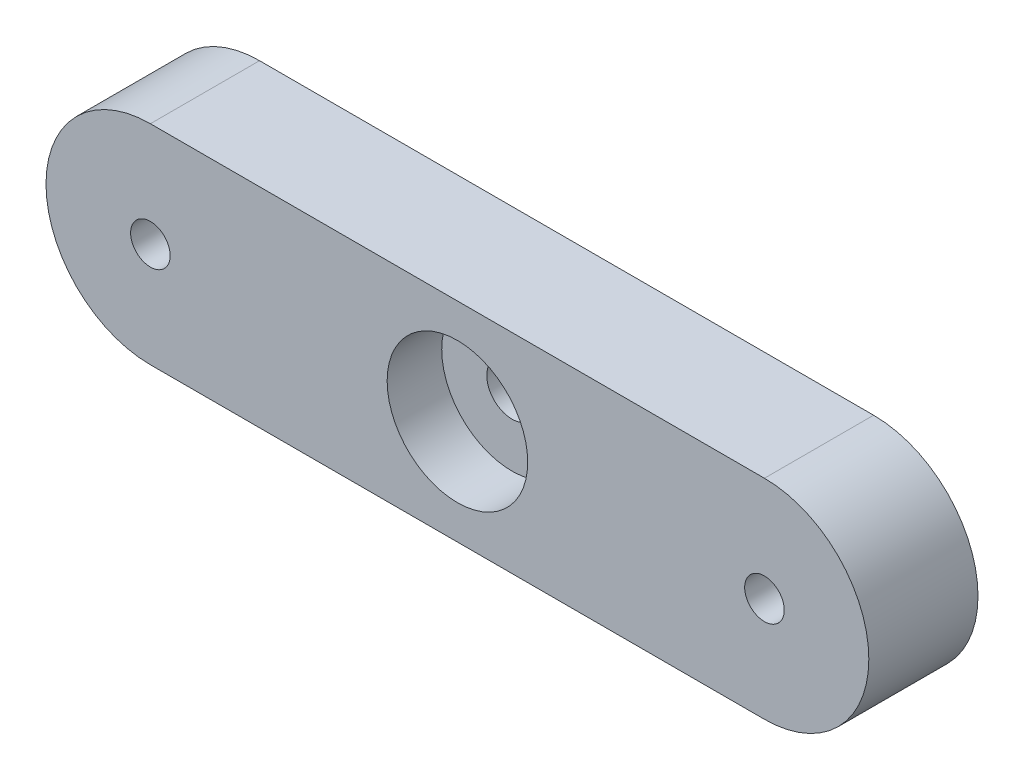
ISO-10303-21;
HEADER;
FILE_DESCRIPTION(('STEP AP214'),'2;1');
FILE_NAME('part.step','',(''),(''),'','','');
FILE_SCHEMA(('AUTOMOTIVE_DESIGN { 1 0 10303 214 1 1 1 1 }'));
ENDSEC;
DATA;
#1=APPLICATION_CONTEXT('core data for automotive mechanical design processes');
#2=APPLICATION_PROTOCOL_DEFINITION('international standard','automotive_design',2000,#1);
#3=PRODUCT_CONTEXT('',#1,'mechanical');
#4=PRODUCT('Part','Part','',(#3));
#5=PRODUCT_RELATED_PRODUCT_CATEGORY('part','',(#4));
#6=PRODUCT_DEFINITION_FORMATION('','',#4);
#7=PRODUCT_DEFINITION_CONTEXT('part definition',#1,'design');
#8=PRODUCT_DEFINITION('design','',#6,#7);
#9=PRODUCT_DEFINITION_SHAPE('','',#8);
#10=(LENGTH_UNIT() NAMED_UNIT(*) SI_UNIT(.MILLI.,.METRE.));
#11=(NAMED_UNIT(*) PLANE_ANGLE_UNIT() SI_UNIT($,.RADIAN.));
#12=(NAMED_UNIT(*) SI_UNIT($,.STERADIAN.) SOLID_ANGLE_UNIT());
#13=UNCERTAINTY_MEASURE_WITH_UNIT(LENGTH_MEASURE(1.E-05),#10,'distance_accuracy_value','');
#14=(GEOMETRIC_REPRESENTATION_CONTEXT(3) GLOBAL_UNCERTAINTY_ASSIGNED_CONTEXT((#13)) GLOBAL_UNIT_ASSIGNED_CONTEXT((#10,
#11,#12)) REPRESENTATION_CONTEXT('',''));
#15=CARTESIAN_POINT('',(0.,0.,0.));
#16=DIRECTION('',(0.,0.,1.));
#17=DIRECTION('',(1.,0.,0.));
#18=AXIS2_PLACEMENT_3D('',#15,#16,#17);
#19=CARTESIAN_POINT('',(22.5,0.,8.));
#20=DIRECTION('',(0.,0.,-1.));
#21=DIRECTION('',(-1.,0.,0.));
#22=AXIS2_PLACEMENT_3D('',#19,#20,#21);
#23=CYLINDRICAL_SURFACE('',#22,5.15);
#24=CARTESIAN_POINT('',(22.5,0.,8.));
#25=DIRECTION('',(0.,0.,1.));
#26=DIRECTION('',(1.,0.,0.));
#27=AXIS2_PLACEMENT_3D('',#24,#25,#26);
#28=CIRCLE('',#27,5.15);
#29=CARTESIAN_POINT('',(27.65,0.,8.));
#30=VERTEX_POINT('',#29);
#31=EDGE_CURVE('E124',#30,#30,#28,.T.);
#32=ORIENTED_EDGE('',*,*,#31,.T.);
#33=EDGE_LOOP('',(#32));
#34=FACE_BOUND('',#33,.T.);
#35=CARTESIAN_POINT('',(22.5,0.,4.));
#36=DIRECTION('',(0.,0.,-1.));
#37=DIRECTION('',(-1.,0.,0.));
#38=AXIS2_PLACEMENT_3D('',#35,#36,#37);
#39=CIRCLE('',#38,5.15);
#40=CARTESIAN_POINT('',(17.35,0.,4.));
#41=VERTEX_POINT('',#40);
#42=EDGE_CURVE('E37',#41,#41,#39,.T.);
#43=ORIENTED_EDGE('',*,*,#42,.T.);
#44=EDGE_LOOP('',(#43));
#45=FACE_BOUND('',#44,.T.);
#46=ADVANCED_FACE('F33',(#34,#45),#23,.F.);
#47=CARTESIAN_POINT('',(0.,0.,8.));
#48=DIRECTION('',(0.,0.,1.));
#49=DIRECTION('',(1.,0.,0.));
#50=AXIS2_PLACEMENT_3D('',#47,#48,#49);
#51=PLANE('',#50);
#52=CARTESIAN_POINT('',(45.,0.,8.));
#53=DIRECTION('',(0.,0.,1.));
#54=DIRECTION('',(1.,0.,0.));
#55=AXIS2_PLACEMENT_3D('',#52,#53,#54);
#56=CIRCLE('',#55,1.45);
#57=CARTESIAN_POINT('',(46.45,0.,8.));
#58=VERTEX_POINT('',#57);
#59=EDGE_CURVE('E118',#58,#58,#56,.T.);
#60=ORIENTED_EDGE('',*,*,#59,.F.);
#61=EDGE_LOOP('',(#60));
#62=FACE_BOUND('',#61,.T.);
#63=CARTESIAN_POINT('',(0.,0.,8.));
#64=DIRECTION('',(0.,0.,1.));
#65=DIRECTION('',(1.,0.,0.));
#66=AXIS2_PLACEMENT_3D('',#63,#64,#65);
#67=CIRCLE('',#66,7.65);
#68=CARTESIAN_POINT('',(0.,7.65,8.));
#69=VERTEX_POINT('',#68);
#70=CARTESIAN_POINT('',(0.,-7.65,8.));
#71=VERTEX_POINT('',#70);
#72=EDGE_CURVE('E87',#69,#71,#67,.T.);
#73=ORIENTED_EDGE('',*,*,#72,.T.);
#74=DIRECTION('',(1.,0.,0.));
#75=VECTOR('',#74,1.);
#76=CARTESIAN_POINT('',(0.,-7.65,8.));
#77=LINE('',#76,#75);
#78=CARTESIAN_POINT('',(45.,-7.65,8.));
#79=VERTEX_POINT('',#78);
#80=EDGE_CURVE('E81',#71,#79,#77,.T.);
#81=ORIENTED_EDGE('',*,*,#80,.T.);
#82=CARTESIAN_POINT('',(45.,0.,8.));
#83=DIRECTION('',(0.,0.,1.));
#84=DIRECTION('',(1.,0.,0.));
#85=AXIS2_PLACEMENT_3D('',#82,#83,#84);
#86=CIRCLE('',#85,7.65);
#87=CARTESIAN_POINT('',(45.,7.65,8.));
#88=VERTEX_POINT('',#87);
#89=EDGE_CURVE('E85',#79,#88,#86,.T.);
#90=ORIENTED_EDGE('',*,*,#89,.T.);
#91=DIRECTION('',(-1.,0.,0.));
#92=VECTOR('',#91,1.);
#93=CARTESIAN_POINT('',(0.,7.65,8.));
#94=LINE('',#93,#92);
#95=EDGE_CURVE('E51',#88,#69,#94,.T.);
#96=ORIENTED_EDGE('',*,*,#95,.T.);
#97=EDGE_LOOP('',(#73,#81,#90,#96));
#98=FACE_BOUND('',#97,.T.);
#99=CARTESIAN_POINT('',(0.,0.,8.));
#100=DIRECTION('',(0.,0.,1.));
#101=DIRECTION('',(1.,0.,0.));
#102=AXIS2_PLACEMENT_3D('',#99,#100,#101);
#103=CIRCLE('',#102,1.45);
#104=CARTESIAN_POINT('',(1.45,0.,8.));
#105=VERTEX_POINT('',#104);
#106=EDGE_CURVE('E103',#105,#105,#103,.T.);
#107=ORIENTED_EDGE('',*,*,#106,.F.);
#108=EDGE_LOOP('',(#107));
#109=FACE_BOUND('',#108,.T.);
#110=ORIENTED_EDGE('',*,*,#31,.F.);
#111=EDGE_LOOP('',(#110));
#112=FACE_BOUND('',#111,.T.);
#113=ADVANCED_FACE('F82',(#62,#98,#109,#112),#51,.T.);
#114=CARTESIAN_POINT('',(0.,0.,0.));
#115=DIRECTION('',(0.,0.,1.));
#116=DIRECTION('',(1.,0.,0.));
#117=AXIS2_PLACEMENT_3D('',#114,#115,#116);
#118=PLANE('',#117);
#119=CARTESIAN_POINT('',(0.,0.,0.));
#120=DIRECTION('',(0.,0.,1.));
#121=DIRECTION('',(1.,0.,0.));
#122=AXIS2_PLACEMENT_3D('',#119,#120,#121);
#123=CIRCLE('',#122,7.65);
#124=CARTESIAN_POINT('',(0.,7.65,0.));
#125=VERTEX_POINT('',#124);
#126=CARTESIAN_POINT('',(0.,-7.65,0.));
#127=VERTEX_POINT('',#126);
#128=EDGE_CURVE('E100',#125,#127,#123,.T.);
#129=ORIENTED_EDGE('',*,*,#128,.F.);
#130=DIRECTION('',(-1.,0.,0.));
#131=VECTOR('',#130,1.);
#132=CARTESIAN_POINT('',(0.,7.65,0.));
#133=LINE('',#132,#131);
#134=CARTESIAN_POINT('',(45.,7.65,0.));
#135=VERTEX_POINT('',#134);
#136=EDGE_CURVE('E74',#135,#125,#133,.T.);
#137=ORIENTED_EDGE('',*,*,#136,.F.);
#138=CARTESIAN_POINT('',(45.,0.,0.));
#139=DIRECTION('',(0.,0.,1.));
#140=DIRECTION('',(1.,0.,0.));
#141=AXIS2_PLACEMENT_3D('',#138,#139,#140);
#142=CIRCLE('',#141,7.65);
#143=CARTESIAN_POINT('',(45.,-7.65,0.));
#144=VERTEX_POINT('',#143);
#145=EDGE_CURVE('E68',#144,#135,#142,.T.);
#146=ORIENTED_EDGE('',*,*,#145,.F.);
#147=DIRECTION('',(1.,0.,0.));
#148=VECTOR('',#147,1.);
#149=CARTESIAN_POINT('',(0.,-7.65,0.));
#150=LINE('',#149,#148);
#151=EDGE_CURVE('E91',#127,#144,#150,.T.);
#152=ORIENTED_EDGE('',*,*,#151,.F.);
#153=EDGE_LOOP('',(#129,#137,#146,#152));
#154=FACE_BOUND('',#153,.T.);
#155=CARTESIAN_POINT('',(0.,0.,0.));
#156=DIRECTION('',(0.,0.,1.));
#157=DIRECTION('',(1.,0.,0.));
#158=AXIS2_PLACEMENT_3D('',#155,#156,#157);
#159=CIRCLE('',#158,1.45);
#160=CARTESIAN_POINT('',(1.45,0.,0.));
#161=VERTEX_POINT('',#160);
#162=EDGE_CURVE('E115',#161,#161,#159,.T.);
#163=ORIENTED_EDGE('',*,*,#162,.T.);
#164=EDGE_LOOP('',(#163));
#165=FACE_BOUND('',#164,.T.);
#166=CARTESIAN_POINT('',(45.,0.,0.));
#167=DIRECTION('',(0.,0.,1.));
#168=DIRECTION('',(1.,0.,0.));
#169=AXIS2_PLACEMENT_3D('',#166,#167,#168);
#170=CIRCLE('',#169,1.45);
#171=CARTESIAN_POINT('',(46.45,0.,0.));
#172=VERTEX_POINT('',#171);
#173=EDGE_CURVE('E121',#172,#172,#170,.T.);
#174=ORIENTED_EDGE('',*,*,#173,.T.);
#175=EDGE_LOOP('',(#174));
#176=FACE_BOUND('',#175,.T.);
#177=CARTESIAN_POINT('',(22.5,0.,0.));
#178=DIRECTION('',(0.,0.,-1.));
#179=DIRECTION('',(-1.,0.,0.));
#180=AXIS2_PLACEMENT_3D('',#177,#178,#179);
#181=CIRCLE('',#180,1.85);
#182=CARTESIAN_POINT('',(20.65,0.,0.));
#183=VERTEX_POINT('',#182);
#184=EDGE_CURVE('E129',#183,#183,#181,.T.);
#185=ORIENTED_EDGE('',*,*,#184,.F.);
#186=EDGE_LOOP('',(#185));
#187=FACE_BOUND('',#186,.T.);
#188=ADVANCED_FACE('F111',(#154,#165,#176,#187),#118,.F.);
#189=CARTESIAN_POINT('',(0.,0.,8.));
#190=DIRECTION('',(0.,0.,-1.));
#191=DIRECTION('',(-1.,0.,0.));
#192=AXIS2_PLACEMENT_3D('',#189,#190,#191);
#193=CYLINDRICAL_SURFACE('',#192,7.65);
#194=ORIENTED_EDGE('',*,*,#128,.T.);
#195=DIRECTION('',(0.,0.,-1.));
#196=VECTOR('',#195,1.);
#197=CARTESIAN_POINT('',(0.,-7.65,8.));
#198=LINE('',#197,#196);
#199=EDGE_CURVE('E11',#71,#127,#198,.T.);
#200=ORIENTED_EDGE('',*,*,#199,.F.);
#201=ORIENTED_EDGE('',*,*,#72,.F.);
#202=DIRECTION('',(0.,0.,-1.));
#203=VECTOR('',#202,1.);
#204=CARTESIAN_POINT('',(0.,7.65,8.));
#205=LINE('',#204,#203);
#206=EDGE_CURVE('E96',#69,#125,#205,.T.);
#207=ORIENTED_EDGE('',*,*,#206,.T.);
#208=EDGE_LOOP('',(#194,#200,#201,#207));
#209=FACE_BOUND('',#208,.T.);
#210=ADVANCED_FACE('F35',(#209),#193,.T.);
#211=CARTESIAN_POINT('',(0.,-7.65,8.));
#212=DIRECTION('',(0.,1.,0.));
#213=DIRECTION('',(0.,0.,1.));
#214=AXIS2_PLACEMENT_3D('',#211,#212,#213);
#215=PLANE('',#214);
#216=ORIENTED_EDGE('',*,*,#151,.T.);
#217=DIRECTION('',(0.,0.,-1.));
#218=VECTOR('',#217,1.);
#219=CARTESIAN_POINT('',(45.,-7.65,8.));
#220=LINE('',#219,#218);
#221=EDGE_CURVE('E43',#79,#144,#220,.T.);
#222=ORIENTED_EDGE('',*,*,#221,.F.);
#223=ORIENTED_EDGE('',*,*,#80,.F.);
#224=ORIENTED_EDGE('',*,*,#199,.T.);
#225=EDGE_LOOP('',(#216,#222,#223,#224));
#226=FACE_BOUND('',#225,.T.);
#227=ADVANCED_FACE('F90',(#226),#215,.F.);
#228=CARTESIAN_POINT('',(45.,0.,8.));
#229=DIRECTION('',(0.,0.,-1.));
#230=DIRECTION('',(-1.,0.,0.));
#231=AXIS2_PLACEMENT_3D('',#228,#229,#230);
#232=CYLINDRICAL_SURFACE('',#231,7.65);
#233=ORIENTED_EDGE('',*,*,#145,.T.);
#234=DIRECTION('',(0.,0.,-1.));
#235=VECTOR('',#234,1.);
#236=CARTESIAN_POINT('',(45.,7.65,8.));
#237=LINE('',#236,#235);
#238=EDGE_CURVE('E92',#88,#135,#237,.T.);
#239=ORIENTED_EDGE('',*,*,#238,.F.);
#240=ORIENTED_EDGE('',*,*,#89,.F.);
#241=ORIENTED_EDGE('',*,*,#221,.T.);
#242=EDGE_LOOP('',(#233,#239,#240,#241));
#243=FACE_BOUND('',#242,.T.);
#244=ADVANCED_FACE('F94',(#243),#232,.T.);
#245=CARTESIAN_POINT('',(0.,7.65,8.));
#246=DIRECTION('',(0.,-1.,0.));
#247=DIRECTION('',(0.,0.,-1.));
#248=AXIS2_PLACEMENT_3D('',#245,#246,#247);
#249=PLANE('',#248);
#250=ORIENTED_EDGE('',*,*,#136,.T.);
#251=ORIENTED_EDGE('',*,*,#206,.F.);
#252=ORIENTED_EDGE('',*,*,#95,.F.);
#253=ORIENTED_EDGE('',*,*,#238,.T.);
#254=EDGE_LOOP('',(#250,#251,#252,#253));
#255=FACE_BOUND('',#254,.T.);
#256=ADVANCED_FACE('F108',(#255),#249,.F.);
#257=CARTESIAN_POINT('',(0.,0.,8.));
#258=DIRECTION('',(0.,0.,-1.));
#259=DIRECTION('',(-1.,0.,0.));
#260=AXIS2_PLACEMENT_3D('',#257,#258,#259);
#261=CYLINDRICAL_SURFACE('',#260,1.45);
#262=ORIENTED_EDGE('',*,*,#106,.T.);
#263=EDGE_LOOP('',(#262));
#264=FACE_BOUND('',#263,.T.);
#265=ORIENTED_EDGE('',*,*,#162,.F.);
#266=EDGE_LOOP('',(#265));
#267=FACE_BOUND('',#266,.T.);
#268=ADVANCED_FACE('F151',(#264,#267),#261,.F.);
#269=CARTESIAN_POINT('',(45.,0.,8.));
#270=DIRECTION('',(0.,0.,-1.));
#271=DIRECTION('',(-1.,0.,0.));
#272=AXIS2_PLACEMENT_3D('',#269,#270,#271);
#273=CYLINDRICAL_SURFACE('',#272,1.45);
#274=ORIENTED_EDGE('',*,*,#59,.T.);
#275=EDGE_LOOP('',(#274));
#276=FACE_BOUND('',#275,.T.);
#277=ORIENTED_EDGE('',*,*,#173,.F.);
#278=EDGE_LOOP('',(#277));
#279=FACE_BOUND('',#278,.T.);
#280=ADVANCED_FACE('F143',(#276,#279),#273,.F.);
#281=CARTESIAN_POINT('',(22.5,0.,4.));
#282=DIRECTION('',(0.,0.,-1.));
#283=DIRECTION('',(-1.,0.,0.));
#284=AXIS2_PLACEMENT_3D('',#281,#282,#283);
#285=PLANE('',#284);
#286=CARTESIAN_POINT('',(22.5,0.,4.));
#287=DIRECTION('',(0.,0.,-1.));
#288=DIRECTION('',(-1.,0.,0.));
#289=AXIS2_PLACEMENT_3D('',#286,#287,#288);
#290=CIRCLE('',#289,1.85);
#291=CARTESIAN_POINT('',(20.65,0.,4.));
#292=VERTEX_POINT('',#291);
#293=EDGE_CURVE('E132',#292,#292,#290,.T.);
#294=ORIENTED_EDGE('',*,*,#293,.T.);
#295=EDGE_LOOP('',(#294));
#296=FACE_BOUND('',#295,.T.);
#297=ORIENTED_EDGE('',*,*,#42,.F.);
#298=EDGE_LOOP('',(#297));
#299=FACE_BOUND('',#298,.T.);
#300=ADVANCED_FACE('F140',(#296,#299),#285,.F.);
#301=CARTESIAN_POINT('',(22.5,0.,4.));
#302=DIRECTION('',(0.,0.,-1.));
#303=DIRECTION('',(-1.,0.,0.));
#304=AXIS2_PLACEMENT_3D('',#301,#302,#303);
#305=CYLINDRICAL_SURFACE('',#304,1.85);
#306=ORIENTED_EDGE('',*,*,#293,.F.);
#307=EDGE_LOOP('',(#306));
#308=FACE_BOUND('',#307,.T.);
#309=ORIENTED_EDGE('',*,*,#184,.T.);
#310=EDGE_LOOP('',(#309));
#311=FACE_BOUND('',#310,.T.);
#312=ADVANCED_FACE('F142',(#308,#311),#305,.F.);
#313=CLOSED_SHELL('',(#46,#113,#188,#210,#227,#244,#256,#268,#280,#300,#312));
#314=MANIFOLD_SOLID_BREP('B2',#313);
#315=ADVANCED_BREP_SHAPE_REPRESENTATION('',(#18,#314),#14);
#316=SHAPE_DEFINITION_REPRESENTATION(#9,#315);
ENDSEC;
END-ISO-10303-21;
